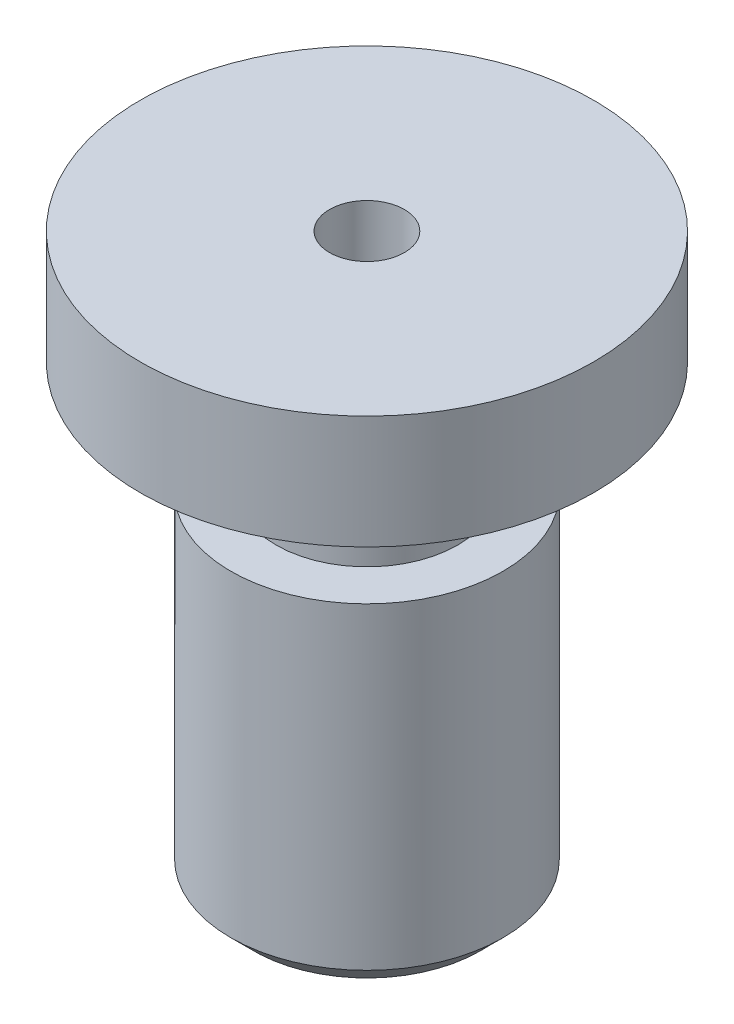
ISO-10303-21;
HEADER;
FILE_DESCRIPTION(('STEP AP214'),'2;1');
FILE_NAME('part.step','',(''),(''),'','','');
FILE_SCHEMA(('AUTOMOTIVE_DESIGN { 1 0 10303 214 1 1 1 1 }'));
ENDSEC;
DATA;
#1=APPLICATION_CONTEXT('core data for automotive mechanical design processes');
#2=APPLICATION_PROTOCOL_DEFINITION('international standard','automotive_design',2000,#1);
#3=PRODUCT_CONTEXT('',#1,'mechanical');
#4=PRODUCT('Part','Part','',(#3));
#5=PRODUCT_RELATED_PRODUCT_CATEGORY('part','',(#4));
#6=PRODUCT_DEFINITION_FORMATION('','',#4);
#7=PRODUCT_DEFINITION_CONTEXT('part definition',#1,'design');
#8=PRODUCT_DEFINITION('design','',#6,#7);
#9=PRODUCT_DEFINITION_SHAPE('','',#8);
#10=(LENGTH_UNIT() NAMED_UNIT(*) SI_UNIT(.MILLI.,.METRE.));
#11=(NAMED_UNIT(*) PLANE_ANGLE_UNIT() SI_UNIT($,.RADIAN.));
#12=(NAMED_UNIT(*) SI_UNIT($,.STERADIAN.) SOLID_ANGLE_UNIT());
#13=UNCERTAINTY_MEASURE_WITH_UNIT(LENGTH_MEASURE(1.E-05),#10,'distance_accuracy_value','');
#14=(GEOMETRIC_REPRESENTATION_CONTEXT(3) GLOBAL_UNCERTAINTY_ASSIGNED_CONTEXT((#13)) GLOBAL_UNIT_ASSIGNED_CONTEXT((#10,
#11,#12)) REPRESENTATION_CONTEXT('',''));
#15=CARTESIAN_POINT('',(0.,0.,0.));
#16=DIRECTION('',(0.,0.,1.));
#17=DIRECTION('',(1.,0.,0.));
#18=AXIS2_PLACEMENT_3D('',#15,#16,#17);
#19=CARTESIAN_POINT('',(0.,0.,0.));
#20=DIRECTION('',(0.,1.,0.));
#21=DIRECTION('',(-1.,0.,0.));
#22=AXIS2_PLACEMENT_3D('',#19,#20,#21);
#23=PLANE('',#22);
#24=CARTESIAN_POINT('',(0.,0.,0.));
#25=DIRECTION('',(0.,1.,0.));
#26=DIRECTION('',(-1.,0.,0.));
#27=AXIS2_PLACEMENT_3D('',#24,#25,#26);
#28=CIRCLE('',#27,5.00000000001641);
#29=CARTESIAN_POINT('',(-5.00000000001641,0.,0.));
#30=VERTEX_POINT('',#29);
#31=EDGE_CURVE('E55',#30,#30,#28,.F.);
#32=ORIENTED_EDGE('',*,*,#31,.T.);
#33=EDGE_LOOP('',(#32));
#34=FACE_BOUND('',#33,.T.);
#35=ADVANCED_FACE('F47',(#34),#23,.F.);
#36=CARTESIAN_POINT('',(6.79635522531406E-13,-198.130084070331,0.));
#37=DIRECTION('',(0.,-1.,0.));
#38=DIRECTION('',(1.,0.,0.));
#39=AXIS2_PLACEMENT_3D('',#36,#37,#38);
#40=CYLINDRICAL_SURFACE('',#39,6.00000000000818);
#41=CARTESIAN_POINT('',(0.,0.999999999991813,0.));
#42=DIRECTION('',(0.,1.,0.));
#43=DIRECTION('',(-1.,0.,0.));
#44=AXIS2_PLACEMENT_3D('',#41,#42,#43);
#45=CIRCLE('',#44,6.00000000000818);
#46=CARTESIAN_POINT('',(-6.00000000000819,0.999999999991792,0.));
#47=VERTEX_POINT('',#46);
#48=EDGE_CURVE('E11',#47,#47,#45,.T.);
#49=ORIENTED_EDGE('',*,*,#48,.T.);
#50=EDGE_LOOP('',(#49));
#51=FACE_BOUND('',#50,.T.);
#52=CARTESIAN_POINT('',(0.,15.,0.));
#53=DIRECTION('',(0.,-1.,0.));
#54=DIRECTION('',(1.,0.,0.));
#55=AXIS2_PLACEMENT_3D('',#52,#53,#54);
#56=CIRCLE('',#55,5.99999999999995);
#57=CARTESIAN_POINT('',(5.9999999999999,15.0000000000001,0.));
#58=VERTEX_POINT('',#57);
#59=EDGE_CURVE('E84',#58,#58,#56,.T.);
#60=ORIENTED_EDGE('',*,*,#59,.T.);
#61=EDGE_LOOP('',(#60));
#62=FACE_BOUND('',#61,.T.);
#63=ADVANCED_FACE('F101',(#51,#62),#40,.T.);
#64=CARTESIAN_POINT('',(-6.,15.,0.));
#65=DIRECTION('',(0.,-1.,0.));
#66=DIRECTION('',(1.,0.,0.));
#67=AXIS2_PLACEMENT_3D('',#64,#65,#66);
#68=PLANE('',#67);
#69=ORIENTED_EDGE('',*,*,#59,.F.);
#70=EDGE_LOOP('',(#69));
#71=FACE_BOUND('',#70,.T.);
#72=CARTESIAN_POINT('',(0.,15.,0.));
#73=DIRECTION('',(0.,-1.,0.));
#74=DIRECTION('',(1.,0.,0.));
#75=AXIS2_PLACEMENT_3D('',#72,#73,#74);
#76=CIRCLE('',#75,3.99999999999995);
#77=CARTESIAN_POINT('',(3.9999999999999,15.,0.));
#78=VERTEX_POINT('',#77);
#79=EDGE_CURVE('E81',#78,#78,#76,.T.);
#80=ORIENTED_EDGE('',*,*,#79,.T.);
#81=EDGE_LOOP('',(#80));
#82=FACE_BOUND('',#81,.T.);
#83=ADVANCED_FACE('F105',(#71,#82),#68,.F.);
#84=CARTESIAN_POINT('',(6.79635522531406E-13,-198.130084070331,0.));
#85=DIRECTION('',(0.,-1.,0.));
#86=DIRECTION('',(1.,0.,0.));
#87=AXIS2_PLACEMENT_3D('',#84,#85,#86);
#88=CYLINDRICAL_SURFACE('',#87,3.99999999999994);
#89=ORIENTED_EDGE('',*,*,#79,.F.);
#90=EDGE_LOOP('',(#89));
#91=FACE_BOUND('',#90,.T.);
#92=CARTESIAN_POINT('',(0.,20.,0.));
#93=DIRECTION('',(0.,-1.,0.));
#94=DIRECTION('',(1.,0.,0.));
#95=AXIS2_PLACEMENT_3D('',#92,#93,#94);
#96=CIRCLE('',#95,3.99999999999993);
#97=CARTESIAN_POINT('',(3.99999999999986,20.,0.));
#98=VERTEX_POINT('',#97);
#99=EDGE_CURVE('E78',#98,#98,#96,.T.);
#100=ORIENTED_EDGE('',*,*,#99,.T.);
#101=EDGE_LOOP('',(#100));
#102=FACE_BOUND('',#101,.T.);
#103=ADVANCED_FACE('F111',(#91,#102),#88,.T.);
#104=CARTESIAN_POINT('',(-4.,20.,0.));
#105=DIRECTION('',(0.,1.,0.));
#106=DIRECTION('',(-1.,0.,0.));
#107=AXIS2_PLACEMENT_3D('',#104,#105,#106);
#108=PLANE('',#107);
#109=ORIENTED_EDGE('',*,*,#99,.F.);
#110=EDGE_LOOP('',(#109));
#111=FACE_BOUND('',#110,.T.);
#112=CARTESIAN_POINT('',(0.,20.,0.));
#113=DIRECTION('',(0.,-1.,0.));
#114=DIRECTION('',(1.,0.,0.));
#115=AXIS2_PLACEMENT_3D('',#112,#113,#114);
#116=CIRCLE('',#115,9.99999999999993);
#117=CARTESIAN_POINT('',(9.99999999999986,20.0000000000001,0.));
#118=VERTEX_POINT('',#117);
#119=EDGE_CURVE('E71',#118,#118,#116,.T.);
#120=ORIENTED_EDGE('',*,*,#119,.T.);
#121=EDGE_LOOP('',(#120));
#122=FACE_BOUND('',#121,.T.);
#123=ADVANCED_FACE('F115',(#111,#122),#108,.F.);
#124=CARTESIAN_POINT('',(6.79635522531406E-13,-198.130084070331,0.));
#125=DIRECTION('',(0.,-1.,0.));
#126=DIRECTION('',(1.,0.,0.));
#127=AXIS2_PLACEMENT_3D('',#124,#125,#126);
#128=CYLINDRICAL_SURFACE('',#127,9.99999999999992);
#129=ORIENTED_EDGE('',*,*,#119,.F.);
#130=EDGE_LOOP('',(#129));
#131=FACE_BOUND('',#130,.T.);
#132=CARTESIAN_POINT('',(0.,25.,0.));
#133=DIRECTION('',(0.,-1.,0.));
#134=DIRECTION('',(1.,0.,0.));
#135=AXIS2_PLACEMENT_3D('',#132,#133,#134);
#136=CIRCLE('',#135,9.99999999999991);
#137=CARTESIAN_POINT('',(9.99999999999983,25.0000000000001,0.));
#138=VERTEX_POINT('',#137);
#139=EDGE_CURVE('E67',#138,#138,#136,.T.);
#140=ORIENTED_EDGE('',*,*,#139,.T.);
#141=EDGE_LOOP('',(#140));
#142=FACE_BOUND('',#141,.T.);
#143=ADVANCED_FACE('F96',(#131,#142),#128,.T.);
#144=CARTESIAN_POINT('',(-10.,25.,0.));
#145=DIRECTION('',(0.,-1.,0.));
#146=DIRECTION('',(1.,0.,0.));
#147=AXIS2_PLACEMENT_3D('',#144,#145,#146);
#148=PLANE('',#147);
#149=CARTESIAN_POINT('',(0.,25.,0.));
#150=DIRECTION('',(0.,1.,0.));
#151=DIRECTION('',(0.,0.,1.));
#152=AXIS2_PLACEMENT_3D('',#149,#150,#151);
#153=CIRCLE('',#152,1.64999999999999);
#154=CARTESIAN_POINT('',(0.,25.,1.64999999999999));
#155=VERTEX_POINT('',#154);
#156=EDGE_CURVE('E68',#155,#155,#153,.T.);
#157=ORIENTED_EDGE('',*,*,#156,.F.);
#158=EDGE_LOOP('',(#157));
#159=FACE_BOUND('',#158,.T.);
#160=ORIENTED_EDGE('',*,*,#139,.F.);
#161=EDGE_LOOP('',(#160));
#162=FACE_BOUND('',#161,.T.);
#163=ADVANCED_FACE('F91',(#159,#162),#148,.F.);
#164=CARTESIAN_POINT('',(0.,0.,0.));
#165=DIRECTION('',(0.,1.,0.));
#166=DIRECTION('',(-1.,0.,0.));
#167=AXIS2_PLACEMENT_3D('',#164,#165,#166);
#168=CONICAL_SURFACE('',#167,5.0000000000164,0.785398163397435);
#169=ORIENTED_EDGE('',*,*,#48,.F.);
#170=EDGE_LOOP('',(#169));
#171=FACE_BOUND('',#170,.T.);
#172=ORIENTED_EDGE('',*,*,#31,.F.);
#173=EDGE_LOOP('',(#172));
#174=FACE_BOUND('',#173,.T.);
#175=ADVANCED_FACE('F50',(#171,#174),#168,.T.);
#176=CARTESIAN_POINT('',(0.,15.,0.));
#177=DIRECTION('',(0.,1.,0.));
#178=DIRECTION('',(0.,0.,1.));
#179=AXIS2_PLACEMENT_3D('',#176,#177,#178);
#180=CONICAL_SURFACE('',#179,1.65,1.02974425867665);
#181=CARTESIAN_POINT('',(0.,14.0085799786045,0.));
#182=VERTEX_POINT('',#181);
#183=VERTEX_LOOP('',#182);
#184=FACE_BOUND('',#183,.T.);
#185=CARTESIAN_POINT('',(0.,15.,0.));
#186=DIRECTION('',(0.,1.,0.));
#187=DIRECTION('',(0.,0.,1.));
#188=AXIS2_PLACEMENT_3D('',#185,#186,#187);
#189=CIRCLE('',#188,1.65);
#190=CARTESIAN_POINT('',(0.,15.,1.65));
#191=VERTEX_POINT('',#190);
#192=EDGE_CURVE('E65',#191,#191,#189,.T.);
#193=ORIENTED_EDGE('',*,*,#192,.T.);
#194=EDGE_LOOP('',(#193));
#195=FACE_BOUND('',#194,.T.);
#196=ADVANCED_FACE('F58',(#184,#195),#180,.F.);
#197=CARTESIAN_POINT('',(0.,25.,0.));
#198=DIRECTION('',(0.,1.,0.));
#199=DIRECTION('',(0.,0.,1.));
#200=AXIS2_PLACEMENT_3D('',#197,#198,#199);
#201=CYLINDRICAL_SURFACE('',#200,1.64999999999999);
#202=ORIENTED_EDGE('',*,*,#192,.F.);
#203=EDGE_LOOP('',(#202));
#204=FACE_BOUND('',#203,.T.);
#205=ORIENTED_EDGE('',*,*,#156,.T.);
#206=EDGE_LOOP('',(#205));
#207=FACE_BOUND('',#206,.T.);
#208=ADVANCED_FACE('F61',(#204,#207),#201,.F.);
#209=CLOSED_SHELL('',(#35,#63,#83,#103,#123,#143,#163,#175,#196,#208));
#210=MANIFOLD_SOLID_BREP('B2',#209);
#211=ADVANCED_BREP_SHAPE_REPRESENTATION('',(#18,#210),#14);
#212=SHAPE_DEFINITION_REPRESENTATION(#9,#211);
ENDSEC;
END-ISO-10303-21;
